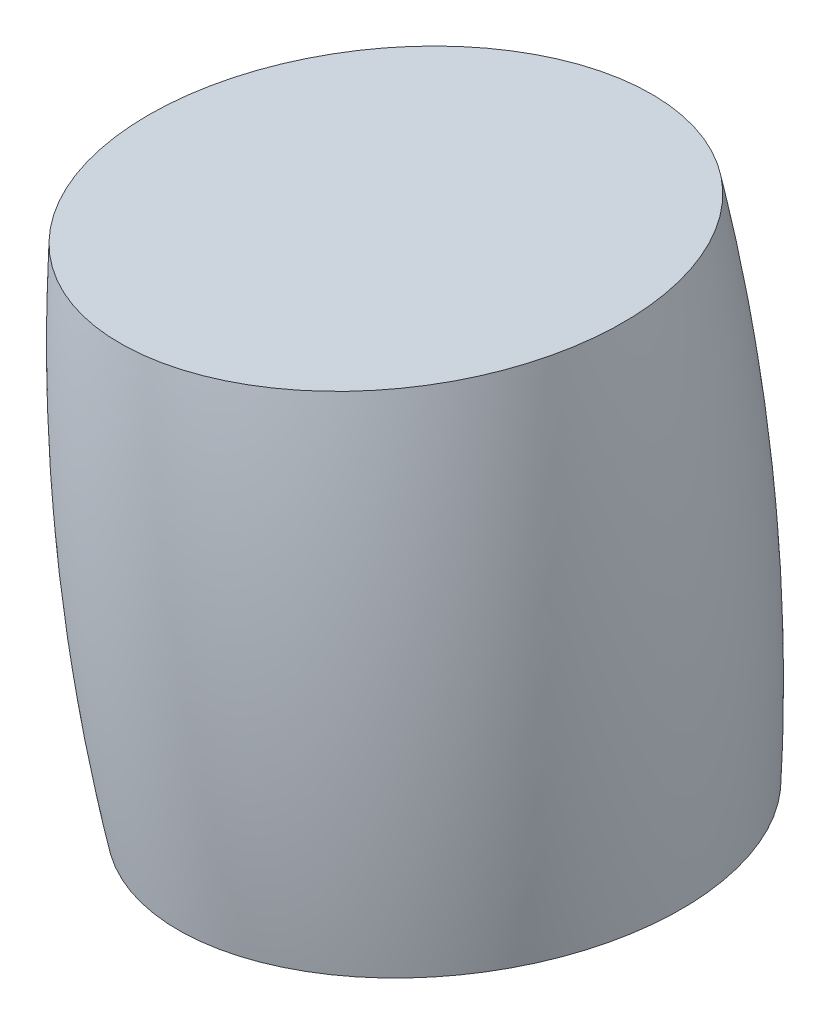
ISO-10303-21;
HEADER;
FILE_DESCRIPTION(('STEP AP214'),'2;1');
FILE_NAME('part.step','',(''),(''),'','','');
FILE_SCHEMA(('AUTOMOTIVE_DESIGN { 1 0 10303 214 1 1 1 1 }'));
ENDSEC;
DATA;
#1=APPLICATION_CONTEXT('core data for automotive mechanical design processes');
#2=APPLICATION_PROTOCOL_DEFINITION('international standard','automotive_design',2000,#1);
#3=PRODUCT_CONTEXT('',#1,'mechanical');
#4=PRODUCT('Part','Part','',(#3));
#5=PRODUCT_RELATED_PRODUCT_CATEGORY('part','',(#4));
#6=PRODUCT_DEFINITION_FORMATION('','',#4);
#7=PRODUCT_DEFINITION_CONTEXT('part definition',#1,'design');
#8=PRODUCT_DEFINITION('design','',#6,#7);
#9=PRODUCT_DEFINITION_SHAPE('','',#8);
#10=(LENGTH_UNIT() NAMED_UNIT(*) SI_UNIT(.MILLI.,.METRE.));
#11=(NAMED_UNIT(*) PLANE_ANGLE_UNIT() SI_UNIT($,.RADIAN.));
#12=(NAMED_UNIT(*) SI_UNIT($,.STERADIAN.) SOLID_ANGLE_UNIT());
#13=UNCERTAINTY_MEASURE_WITH_UNIT(LENGTH_MEASURE(1.E-05),#10,'distance_accuracy_value','');
#14=(GEOMETRIC_REPRESENTATION_CONTEXT(3) GLOBAL_UNCERTAINTY_ASSIGNED_CONTEXT((#13)) GLOBAL_UNIT_ASSIGNED_CONTEXT((#10,
#11,#12)) REPRESENTATION_CONTEXT('',''));
#15=CARTESIAN_POINT('',(0.,0.,0.));
#16=DIRECTION('',(0.,0.,1.));
#17=DIRECTION('',(1.,0.,0.));
#18=AXIS2_PLACEMENT_3D('',#15,#16,#17);
#19=CARTESIAN_POINT('',(1.08483012230545,-8.93437986688968,0.));
#20=DIRECTION('',(0.120536680255446,-0.992708874098039,0.));
#21=DIRECTION('',(0.992708874098039,0.120536680255446,0.));
#22=AXIS2_PLACEMENT_3D('',#19,#20,#21);
#23=PLANE('',#22);
#24=CARTESIAN_POINT('',(61.1437170052302,-1.64191071143597,0.));
#25=DIRECTION('',(-0.120536680255446,0.992708874098039,0.));
#26=DIRECTION('',(-0.992708874098039,-0.120536680255446,0.));
#27=AXIS2_PLACEMENT_3D('',#24,#25,#26);
#28=CIRCLE('',#27,8.91901756723223);
#29=CARTESIAN_POINT('',(52.2897291180025,-2.71697948013016,0.));
#30=VERTEX_POINT('',#29);
#31=EDGE_CURVE('E18',#30,#30,#28,.T.);
#32=ORIENTED_EDGE('',*,*,#31,.F.);
#33=EDGE_LOOP('',(#32));
#34=FACE_BOUND('',#33,.T.);
#35=ADVANCED_FACE('F15',(#34),#23,.T.);
#36=CARTESIAN_POINT('',(-1.08483012229734,8.93437986687775,0.));
#37=DIRECTION('',(0.120536680255446,-0.992708874098039,0.));
#38=DIRECTION('',(0.992708874098039,0.120536680255446,0.));
#39=AXIS2_PLACEMENT_3D('',#36,#37,#38);
#40=PLANE('',#39);
#41=CARTESIAN_POINT('',(58.9740567606318,16.226849022332,0.));
#42=DIRECTION('',(-0.120536680255446,0.992708874098039,0.));
#43=DIRECTION('',(-0.992708874098039,-0.120536680255446,0.));
#44=AXIS2_PLACEMENT_3D('',#41,#42,#43);
#45=CIRCLE('',#44,8.91901756723388);
#46=CARTESIAN_POINT('',(50.1200688734024,15.1517802536376,0.));
#47=VERTEX_POINT('',#46);
#48=EDGE_CURVE('E9',#47,#47,#45,.F.);
#49=ORIENTED_EDGE('',*,*,#48,.F.);
#50=EDGE_LOOP('',(#49));
#51=FACE_BOUND('',#50,.T.);
#52=ADVANCED_FACE('F30',(#51),#40,.F.);
#53=CARTESIAN_POINT('',(120.11777376586,14.5849383109087,0.));
#54=DIRECTION('',(0.,0.,1.));
#55=DIRECTION('',(-0.992708874098039,-0.120536680255446,0.));
#56=AXIS2_PLACEMENT_3D('',#53,#54,#55);
#57=CIRCLE('',#56,69.9999999999977);
#58=TRIMMED_CURVE('',#57,(PARAMETER_VALUE(-0.527067740061181)),
(PARAMETER_VALUE(0.527067740061181)),.T.,.PARAMETER.);
#59=CARTESIAN_POINT('',(60.0588868829302,7.29246915545437,0.));
#60=DIRECTION('',(-0.120536680255446,0.992708874098039,0.));
#61=AXIS1_PLACEMENT('',#59,#60);
#62=SURFACE_OF_REVOLUTION('',#58,#61);
#63=ORIENTED_EDGE('',*,*,#48,.T.);
#64=EDGE_LOOP('',(#63));
#65=FACE_BOUND('',#64,.T.);
#66=ORIENTED_EDGE('',*,*,#31,.T.);
#67=EDGE_LOOP('',(#66));
#68=FACE_BOUND('',#67,.T.);
#69=ADVANCED_FACE('F28',(#65,#68),#62,.F.);
#70=CLOSED_SHELL('',(#35,#52,#69));
#71=MANIFOLD_SOLID_BREP('B1',#70);
#72=ADVANCED_BREP_SHAPE_REPRESENTATION('',(#18,#71),#14);
#73=SHAPE_DEFINITION_REPRESENTATION(#9,#72);
ENDSEC;
END-ISO-10303-21;
